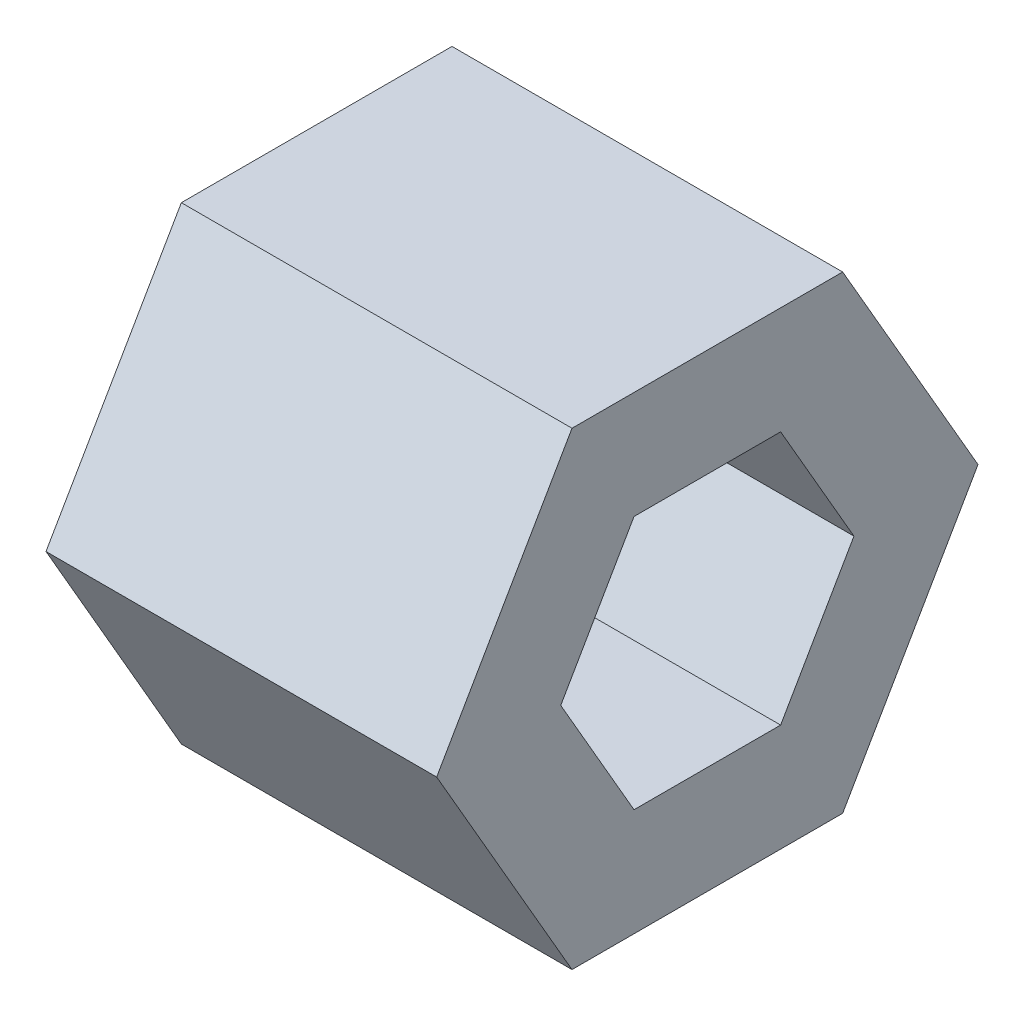
ISO-10303-21;
HEADER;
FILE_DESCRIPTION(('STEP AP214'),'2;1');
FILE_NAME('part.step','',(''),(''),'','','');
FILE_SCHEMA(('AUTOMOTIVE_DESIGN { 1 0 10303 214 1 1 1 1 }'));
ENDSEC;
DATA;
#1=APPLICATION_CONTEXT('core data for automotive mechanical design processes');
#2=APPLICATION_PROTOCOL_DEFINITION('international standard','automotive_design',2000,#1);
#3=PRODUCT_CONTEXT('',#1,'mechanical');
#4=PRODUCT('Part','Part','',(#3));
#5=PRODUCT_RELATED_PRODUCT_CATEGORY('part','',(#4));
#6=PRODUCT_DEFINITION_FORMATION('','',#4);
#7=PRODUCT_DEFINITION_CONTEXT('part definition',#1,'design');
#8=PRODUCT_DEFINITION('design','',#6,#7);
#9=PRODUCT_DEFINITION_SHAPE('','',#8);
#10=(LENGTH_UNIT() NAMED_UNIT(*) SI_UNIT(.MILLI.,.METRE.));
#11=(NAMED_UNIT(*) PLANE_ANGLE_UNIT() SI_UNIT($,.RADIAN.));
#12=(NAMED_UNIT(*) SI_UNIT($,.STERADIAN.) SOLID_ANGLE_UNIT());
#13=UNCERTAINTY_MEASURE_WITH_UNIT(LENGTH_MEASURE(1.E-05),#10,'distance_accuracy_value','');
#14=(GEOMETRIC_REPRESENTATION_CONTEXT(3) GLOBAL_UNCERTAINTY_ASSIGNED_CONTEXT((#13)) GLOBAL_UNIT_ASSIGNED_CONTEXT((#10,
#11,#12)) REPRESENTATION_CONTEXT('',''));
#15=CARTESIAN_POINT('',(0.,0.,0.));
#16=DIRECTION('',(0.,0.,1.));
#17=DIRECTION('',(1.,0.,0.));
#18=AXIS2_PLACEMENT_3D('',#15,#16,#17);
#19=CARTESIAN_POINT('',(0.,0.,0.));
#20=DIRECTION('',(1.,0.,0.));
#21=DIRECTION('',(0.,0.,-1.));
#22=AXIS2_PLACEMENT_3D('',#19,#20,#21);
#23=CYLINDRICAL_SURFACE('',#22,1.5);
#24=DIRECTION('',(1.,0.,0.));
#25=VECTOR('',#24,1.);
#26=CARTESIAN_POINT('',(0.,0.,1.5));
#27=LINE('',#26,#25);
#28=CARTESIAN_POINT('',(0.,0.,1.5));
#29=VERTEX_POINT('',#28);
#30=CARTESIAN_POINT('',(3.,0.,1.5));
#31=VERTEX_POINT('',#30);
#32=EDGE_CURVE('E275',#29,#31,#27,.T.);
#33=ORIENTED_EDGE('',*,*,#32,.F.);
#34=CARTESIAN_POINT('',(0.,0.,0.));
#35=DIRECTION('',(1.,0.,0.));
#36=DIRECTION('',(0.,0.,-1.));
#37=AXIS2_PLACEMENT_3D('',#34,#35,#36);
#38=CIRCLE('',#37,1.5);
#39=CARTESIAN_POINT('',(0.,0.,-1.5));
#40=VERTEX_POINT('',#39);
#41=EDGE_CURVE('E120',#40,#29,#38,.T.);
#42=ORIENTED_EDGE('',*,*,#41,.F.);
#43=DIRECTION('',(1.,0.,0.));
#44=VECTOR('',#43,1.);
#45=CARTESIAN_POINT('',(0.,0.,-1.5));
#46=LINE('',#45,#44);
#47=CARTESIAN_POINT('',(3.,0.,-1.5));
#48=VERTEX_POINT('',#47);
#49=EDGE_CURVE('E236',#40,#48,#46,.T.);
#50=ORIENTED_EDGE('',*,*,#49,.T.);
#51=CARTESIAN_POINT('',(3.,0.,0.));
#52=DIRECTION('',(1.,0.,0.));
#53=DIRECTION('',(0.,0.,-1.));
#54=AXIS2_PLACEMENT_3D('',#51,#52,#53);
#55=CIRCLE('',#54,1.5);
#56=EDGE_CURVE('E11',#48,#31,#55,.T.);
#57=ORIENTED_EDGE('',*,*,#56,.T.);
#58=EDGE_LOOP('',(#33,#42,#50,#57));
#59=FACE_BOUND('',#58,.T.);
#60=ADVANCED_FACE('F16',(#59),#23,.F.);
#61=CARTESIAN_POINT('',(3.,0.,0.));
#62=DIRECTION('',(1.,0.,0.));
#63=DIRECTION('',(0.,1.,0.));
#64=AXIS2_PLACEMENT_3D('',#61,#62,#63);
#65=PLANE('',#64);
#66=ORIENTED_EDGE('',*,*,#56,.F.);
#67=CARTESIAN_POINT('',(3.,0.,0.));
#68=DIRECTION('',(1.,0.,0.));
#69=DIRECTION('',(0.,0.,-1.));
#70=AXIS2_PLACEMENT_3D('',#67,#68,#69);
#71=CIRCLE('',#70,1.5);
#72=EDGE_CURVE('E291',#31,#48,#71,.T.);
#73=ORIENTED_EDGE('',*,*,#72,.F.);
#74=EDGE_LOOP('',(#66,#73));
#75=FACE_BOUND('',#74,.T.);
#76=DIRECTION('',(0.,0.866025403784439,-0.5));
#77=VECTOR('',#76,1.);
#78=CARTESIAN_POINT('',(3.,-3.25,-1.87638837486628));
#79=LINE('',#78,#77);
#80=CARTESIAN_POINT('',(3.,-3.25,-1.87638837486628));
#81=VERTEX_POINT('',#80);
#82=CARTESIAN_POINT('',(3.,0.,-3.75277674973257));
#83=VERTEX_POINT('',#82);
#84=EDGE_CURVE('E232',#81,#83,#79,.T.);
#85=ORIENTED_EDGE('',*,*,#84,.T.);
#86=DIRECTION('',(0.,0.866025403784439,0.5));
#87=VECTOR('',#86,1.);
#88=CARTESIAN_POINT('',(3.,0.,-3.75277674973257));
#89=LINE('',#88,#87);
#90=CARTESIAN_POINT('',(3.,3.25,-1.87638837486628));
#91=VERTEX_POINT('',#90);
#92=EDGE_CURVE('E26',#83,#91,#89,.T.);
#93=ORIENTED_EDGE('',*,*,#92,.T.);
#94=DIRECTION('',(0.,0.,1.));
#95=VECTOR('',#94,1.);
#96=CARTESIAN_POINT('',(3.,3.25,-1.87638837486628));
#97=LINE('',#96,#95);
#98=CARTESIAN_POINT('',(3.,3.25,1.87638837486628));
#99=VERTEX_POINT('',#98);
#100=EDGE_CURVE('E49',#91,#99,#97,.T.);
#101=ORIENTED_EDGE('',*,*,#100,.T.);
#102=DIRECTION('',(0.,-0.866025403784439,0.5));
#103=VECTOR('',#102,1.);
#104=CARTESIAN_POINT('',(3.,3.25,1.87638837486628));
#105=LINE('',#104,#103);
#106=CARTESIAN_POINT('',(3.,0.,3.75277674973256));
#107=VERTEX_POINT('',#106);
#108=EDGE_CURVE('E287',#99,#107,#105,.T.);
#109=ORIENTED_EDGE('',*,*,#108,.T.);
#110=DIRECTION('',(0.,-0.866025403784439,-0.5));
#111=VECTOR('',#110,1.);
#112=CARTESIAN_POINT('',(3.,0.,3.75277674973256));
#113=LINE('',#112,#111);
#114=CARTESIAN_POINT('',(3.,-3.25,1.87638837486628));
#115=VERTEX_POINT('',#114);
#116=EDGE_CURVE('E237',#107,#115,#113,.T.);
#117=ORIENTED_EDGE('',*,*,#116,.T.);
#118=DIRECTION('',(0.,0.,-1.));
#119=VECTOR('',#118,1.);
#120=CARTESIAN_POINT('',(3.,-3.25,1.87638837486628));
#121=LINE('',#120,#119);
#122=EDGE_CURVE('E181',#115,#81,#121,.T.);
#123=ORIENTED_EDGE('',*,*,#122,.T.);
#124=EDGE_LOOP('',(#85,#93,#101,#109,#117,#123));
#125=FACE_BOUND('',#124,.T.);
#126=ADVANCED_FACE('F511',(#75,#125),#65,.T.);
#127=CARTESIAN_POINT('',(3.,0.,-3.75277674973257));
#128=DIRECTION('',(0.,0.5,-0.866025403784439));
#129=DIRECTION('',(-1.,0.,0.));
#130=AXIS2_PLACEMENT_3D('',#127,#128,#129);
#131=PLANE('',#130);
#132=DIRECTION('',(0.,0.866025403784439,0.5));
#133=VECTOR('',#132,1.);
#134=CARTESIAN_POINT('',(10.,0.,-3.75277674973257));
#135=LINE('',#134,#133);
#136=CARTESIAN_POINT('',(10.,0.,-3.75277674973257));
#137=VERTEX_POINT('',#136);
#138=CARTESIAN_POINT('',(10.,3.25,-1.87638837486628));
#139=VERTEX_POINT('',#138);
#140=EDGE_CURVE('E250',#137,#139,#135,.T.);
#141=ORIENTED_EDGE('',*,*,#140,.T.);
#142=DIRECTION('',(1.,0.,0.));
#143=VECTOR('',#142,1.);
#144=CARTESIAN_POINT('',(3.,3.25,-1.87638837486628));
#145=LINE('',#144,#143);
#146=EDGE_CURVE('E211',#91,#139,#145,.T.);
#147=ORIENTED_EDGE('',*,*,#146,.F.);
#148=ORIENTED_EDGE('',*,*,#92,.F.);
#149=DIRECTION('',(1.,0.,0.));
#150=VECTOR('',#149,1.);
#151=CARTESIAN_POINT('',(3.,0.,-3.75277674973257));
#152=LINE('',#151,#150);
#153=EDGE_CURVE('E228',#83,#137,#152,.T.);
#154=ORIENTED_EDGE('',*,*,#153,.T.);
#155=EDGE_LOOP('',(#141,#147,#148,#154));
#156=FACE_BOUND('',#155,.T.);
#157=ADVANCED_FACE('F321',(#156),#131,.F.);
#158=CARTESIAN_POINT('',(3.,3.25,-1.87638837486628));
#159=DIRECTION('',(0.,1.,0.));
#160=DIRECTION('',(1.,0.,0.));
#161=AXIS2_PLACEMENT_3D('',#158,#159,#160);
#162=PLANE('',#161);
#163=DIRECTION('',(0.,0.,1.));
#164=VECTOR('',#163,1.);
#165=CARTESIAN_POINT('',(10.,3.25,-1.87638837486628));
#166=LINE('',#165,#164);
#167=CARTESIAN_POINT('',(10.,3.25,1.87638837486628));
#168=VERTEX_POINT('',#167);
#169=EDGE_CURVE('E227',#139,#168,#166,.T.);
#170=ORIENTED_EDGE('',*,*,#169,.T.);
#171=DIRECTION('',(1.,0.,0.));
#172=VECTOR('',#171,1.);
#173=CARTESIAN_POINT('',(3.,3.25,1.87638837486628));
#174=LINE('',#173,#172);
#175=EDGE_CURVE('E279',#99,#168,#174,.T.);
#176=ORIENTED_EDGE('',*,*,#175,.F.);
#177=ORIENTED_EDGE('',*,*,#100,.F.);
#178=ORIENTED_EDGE('',*,*,#146,.T.);
#179=EDGE_LOOP('',(#170,#176,#177,#178));
#180=FACE_BOUND('',#179,.T.);
#181=ADVANCED_FACE('F329',(#180),#162,.F.);
#182=CARTESIAN_POINT('',(3.,3.25,1.87638837486628));
#183=DIRECTION('',(0.,0.5,0.866025403784439));
#184=DIRECTION('',(1.,0.,0.));
#185=AXIS2_PLACEMENT_3D('',#182,#183,#184);
#186=PLANE('',#185);
#187=DIRECTION('',(0.,-0.866025403784439,0.5));
#188=VECTOR('',#187,1.);
#189=CARTESIAN_POINT('',(10.,3.25,1.87638837486628));
#190=LINE('',#189,#188);
#191=CARTESIAN_POINT('',(10.,0.,3.75277674973256));
#192=VERTEX_POINT('',#191);
#193=EDGE_CURVE('E197',#168,#192,#190,.T.);
#194=ORIENTED_EDGE('',*,*,#193,.T.);
#195=DIRECTION('',(1.,0.,0.));
#196=VECTOR('',#195,1.);
#197=CARTESIAN_POINT('',(3.,0.,3.75277674973256));
#198=LINE('',#197,#196);
#199=EDGE_CURVE('E240',#107,#192,#198,.T.);
#200=ORIENTED_EDGE('',*,*,#199,.F.);
#201=ORIENTED_EDGE('',*,*,#108,.F.);
#202=ORIENTED_EDGE('',*,*,#175,.T.);
#203=EDGE_LOOP('',(#194,#200,#201,#202));
#204=FACE_BOUND('',#203,.T.);
#205=ADVANCED_FACE('F555',(#204),#186,.F.);
#206=CARTESIAN_POINT('',(3.,0.,3.75277674973256));
#207=DIRECTION('',(0.,-0.5,0.866025403784439));
#208=DIRECTION('',(-1.,0.,0.));
#209=AXIS2_PLACEMENT_3D('',#206,#207,#208);
#210=PLANE('',#209);
#211=DIRECTION('',(0.,-0.866025403784439,-0.5));
#212=VECTOR('',#211,1.);
#213=CARTESIAN_POINT('',(10.,0.,3.75277674973256));
#214=LINE('',#213,#212);
#215=CARTESIAN_POINT('',(10.,-3.25,1.87638837486628));
#216=VERTEX_POINT('',#215);
#217=EDGE_CURVE('E186',#192,#216,#214,.T.);
#218=ORIENTED_EDGE('',*,*,#217,.T.);
#219=DIRECTION('',(1.,0.,0.));
#220=VECTOR('',#219,1.);
#221=CARTESIAN_POINT('',(3.,-3.25,1.87638837486628));
#222=LINE('',#221,#220);
#223=EDGE_CURVE('E241',#115,#216,#222,.T.);
#224=ORIENTED_EDGE('',*,*,#223,.F.);
#225=ORIENTED_EDGE('',*,*,#116,.F.);
#226=ORIENTED_EDGE('',*,*,#199,.T.);
#227=EDGE_LOOP('',(#218,#224,#225,#226));
#228=FACE_BOUND('',#227,.T.);
#229=ADVANCED_FACE('F536',(#228),#210,.F.);
#230=CARTESIAN_POINT('',(3.,-3.25,1.87638837486628));
#231=DIRECTION('',(0.,-1.,0.));
#232=DIRECTION('',(0.,0.,-1.));
#233=AXIS2_PLACEMENT_3D('',#230,#231,#232);
#234=PLANE('',#233);
#235=DIRECTION('',(0.,0.,-1.));
#236=VECTOR('',#235,1.);
#237=CARTESIAN_POINT('',(10.,-3.25,1.87638837486628));
#238=LINE('',#237,#236);
#239=CARTESIAN_POINT('',(10.,-3.25,-1.87638837486628));
#240=VERTEX_POINT('',#239);
#241=EDGE_CURVE('E183',#216,#240,#238,.T.);
#242=ORIENTED_EDGE('',*,*,#241,.T.);
#243=DIRECTION('',(1.,0.,0.));
#244=VECTOR('',#243,1.);
#245=CARTESIAN_POINT('',(3.,-3.25,-1.87638837486628));
#246=LINE('',#245,#244);
#247=EDGE_CURVE('E259',#81,#240,#246,.T.);
#248=ORIENTED_EDGE('',*,*,#247,.F.);
#249=ORIENTED_EDGE('',*,*,#122,.F.);
#250=ORIENTED_EDGE('',*,*,#223,.T.);
#251=EDGE_LOOP('',(#242,#248,#249,#250));
#252=FACE_BOUND('',#251,.T.);
#253=ADVANCED_FACE('F532',(#252),#234,.F.);
#254=CARTESIAN_POINT('',(3.,-3.25,-1.87638837486628));
#255=DIRECTION('',(0.,-0.5,-0.866025403784439));
#256=DIRECTION('',(0.,-0.866025403784439,0.5));
#257=AXIS2_PLACEMENT_3D('',#254,#255,#256);
#258=PLANE('',#257);
#259=DIRECTION('',(0.,0.866025403784439,-0.5));
#260=VECTOR('',#259,1.);
#261=CARTESIAN_POINT('',(10.,-3.25,-1.87638837486628));
#262=LINE('',#261,#260);
#263=EDGE_CURVE('E159',#240,#137,#262,.T.);
#264=ORIENTED_EDGE('',*,*,#263,.T.);
#265=ORIENTED_EDGE('',*,*,#153,.F.);
#266=ORIENTED_EDGE('',*,*,#84,.F.);
#267=ORIENTED_EDGE('',*,*,#247,.T.);
#268=EDGE_LOOP('',(#264,#265,#266,#267));
#269=FACE_BOUND('',#268,.T.);
#270=ADVANCED_FACE('F525',(#269),#258,.F.);
#271=CARTESIAN_POINT('',(0.,0.,0.));
#272=DIRECTION('',(1.,0.,0.));
#273=DIRECTION('',(0.,1.,0.));
#274=AXIS2_PLACEMENT_3D('',#271,#272,#273);
#275=PLANE('',#274);
#276=ORIENTED_EDGE('',*,*,#41,.T.);
#277=CARTESIAN_POINT('',(0.,0.,0.));
#278=DIRECTION('',(1.,0.,0.));
#279=DIRECTION('',(0.,0.,-1.));
#280=AXIS2_PLACEMENT_3D('',#277,#278,#279);
#281=CIRCLE('',#280,1.5);
#282=EDGE_CURVE('E273',#29,#40,#281,.T.);
#283=ORIENTED_EDGE('',*,*,#282,.T.);
#284=EDGE_LOOP('',(#276,#283));
#285=FACE_BOUND('',#284,.T.);
#286=DIRECTION('',(0.,0.866025403784442,-0.5));
#287=VECTOR('',#286,1.);
#288=CARTESIAN_POINT('',(0.,-6.,-3.46410161513782));
#289=LINE('',#288,#287);
#290=CARTESIAN_POINT('',(0.,-6.,-3.46410161513782));
#291=VERTEX_POINT('',#290);
#292=CARTESIAN_POINT('',(0.,0.,-6.92820323027551));
#293=VERTEX_POINT('',#292);
#294=EDGE_CURVE('E223',#291,#293,#289,.T.);
#295=ORIENTED_EDGE('',*,*,#294,.F.);
#296=DIRECTION('',(0.,0.,-1.));
#297=VECTOR('',#296,1.);
#298=CARTESIAN_POINT('',(0.,-6.,3.4641016151377));
#299=LINE('',#298,#297);
#300=CARTESIAN_POINT('',(0.,-6.,3.4641016151377));
#301=VERTEX_POINT('',#300);
#302=EDGE_CURVE('E84',#301,#291,#299,.T.);
#303=ORIENTED_EDGE('',*,*,#302,.F.);
#304=DIRECTION('',(0.,-0.866025403784435,-0.500000000000007));
#305=VECTOR('',#304,1.);
#306=CARTESIAN_POINT('',(0.,0.,6.92820323027551));
#307=LINE('',#306,#305);
#308=CARTESIAN_POINT('',(0.,0.,6.92820323027551));
#309=VERTEX_POINT('',#308);
#310=EDGE_CURVE('E172',#309,#301,#307,.T.);
#311=ORIENTED_EDGE('',*,*,#310,.F.);
#312=DIRECTION('',(0.,-0.866025403784442,0.5));
#313=VECTOR('',#312,1.);
#314=CARTESIAN_POINT('',(0.,6.,3.46410161513779));
#315=LINE('',#314,#313);
#316=CARTESIAN_POINT('',(0.,6.,3.46410161513779));
#317=VERTEX_POINT('',#316);
#318=EDGE_CURVE('E207',#317,#309,#315,.T.);
#319=ORIENTED_EDGE('',*,*,#318,.F.);
#320=DIRECTION('',(0.,0.,1.));
#321=VECTOR('',#320,1.);
#322=CARTESIAN_POINT('',(0.,6.,-3.46410161513774));
#323=LINE('',#322,#321);
#324=CARTESIAN_POINT('',(0.,6.,-3.46410161513774));
#325=VERTEX_POINT('',#324);
#326=EDGE_CURVE('E283',#325,#317,#323,.T.);
#327=ORIENTED_EDGE('',*,*,#326,.F.);
#328=DIRECTION('',(0.,0.866025403784438,0.5));
#329=VECTOR('',#328,1.);
#330=CARTESIAN_POINT('',(0.,0.,-6.92820323027551));
#331=LINE('',#330,#329);
#332=EDGE_CURVE('E67',#293,#325,#331,.T.);
#333=ORIENTED_EDGE('',*,*,#332,.F.);
#334=EDGE_LOOP('',(#295,#303,#311,#319,#327,#333));
#335=FACE_BOUND('',#334,.T.);
#336=ADVANCED_FACE('F364',(#285,#335),#275,.F.);
#337=CARTESIAN_POINT('',(10.,0.,0.));
#338=DIRECTION('',(1.,0.,0.));
#339=DIRECTION('',(0.,1.,0.));
#340=AXIS2_PLACEMENT_3D('',#337,#338,#339);
#341=PLANE('',#340);
#342=ORIENTED_EDGE('',*,*,#263,.F.);
#343=ORIENTED_EDGE('',*,*,#241,.F.);
#344=ORIENTED_EDGE('',*,*,#217,.F.);
#345=ORIENTED_EDGE('',*,*,#193,.F.);
#346=ORIENTED_EDGE('',*,*,#169,.F.);
#347=ORIENTED_EDGE('',*,*,#140,.F.);
#348=EDGE_LOOP('',(#342,#343,#344,#345,#346,#347));
#349=FACE_BOUND('',#348,.T.);
#350=DIRECTION('',(0.,0.866025403784442,-0.5));
#351=VECTOR('',#350,1.);
#352=CARTESIAN_POINT('',(10.,-6.,-3.46410161513782));
#353=LINE('',#352,#351);
#354=CARTESIAN_POINT('',(10.,-6.,-3.46410161513782));
#355=VERTEX_POINT('',#354);
#356=CARTESIAN_POINT('',(10.,0.,-6.92820323027551));
#357=VERTEX_POINT('',#356);
#358=EDGE_CURVE('E222',#355,#357,#353,.T.);
#359=ORIENTED_EDGE('',*,*,#358,.T.);
#360=DIRECTION('',(0.,0.866025403784438,0.5));
#361=VECTOR('',#360,1.);
#362=CARTESIAN_POINT('',(10.,0.,-6.92820323027551));
#363=LINE('',#362,#361);
#364=CARTESIAN_POINT('',(10.,6.,-3.46410161513774));
#365=VERTEX_POINT('',#364);
#366=EDGE_CURVE('E246',#357,#365,#363,.T.);
#367=ORIENTED_EDGE('',*,*,#366,.T.);
#368=DIRECTION('',(0.,0.,1.));
#369=VECTOR('',#368,1.);
#370=CARTESIAN_POINT('',(10.,6.,-3.46410161513774));
#371=LINE('',#370,#369);
#372=CARTESIAN_POINT('',(10.,6.,3.46410161513779));
#373=VERTEX_POINT('',#372);
#374=EDGE_CURVE('E215',#365,#373,#371,.T.);
#375=ORIENTED_EDGE('',*,*,#374,.T.);
#376=DIRECTION('',(0.,-0.866025403784442,0.5));
#377=VECTOR('',#376,1.);
#378=CARTESIAN_POINT('',(10.,6.,3.46410161513779));
#379=LINE('',#378,#377);
#380=CARTESIAN_POINT('',(10.,0.,6.92820323027551));
#381=VERTEX_POINT('',#380);
#382=EDGE_CURVE('E165',#373,#381,#379,.T.);
#383=ORIENTED_EDGE('',*,*,#382,.T.);
#384=DIRECTION('',(0.,-0.866025403784435,-0.500000000000007));
#385=VECTOR('',#384,1.);
#386=CARTESIAN_POINT('',(10.,0.,6.92820323027551));
#387=LINE('',#386,#385);
#388=CARTESIAN_POINT('',(10.,-6.,3.4641016151377));
#389=VERTEX_POINT('',#388);
#390=EDGE_CURVE('E162',#381,#389,#387,.T.);
#391=ORIENTED_EDGE('',*,*,#390,.T.);
#392=DIRECTION('',(0.,0.,-1.));
#393=VECTOR('',#392,1.);
#394=CARTESIAN_POINT('',(10.,-6.,3.4641016151377));
#395=LINE('',#394,#393);
#396=EDGE_CURVE('E149',#389,#355,#395,.T.);
#397=ORIENTED_EDGE('',*,*,#396,.T.);
#398=EDGE_LOOP('',(#359,#367,#375,#383,#391,#397));
#399=FACE_BOUND('',#398,.T.);
#400=ADVANCED_FACE('F163',(#349,#399),#341,.T.);
#401=CARTESIAN_POINT('',(10.,-6.,3.4641016151377));
#402=DIRECTION('',(0.,1.,0.));
#403=DIRECTION('',(0.,0.,-1.));
#404=AXIS2_PLACEMENT_3D('',#401,#402,#403);
#405=PLANE('',#404);
#406=ORIENTED_EDGE('',*,*,#302,.T.);
#407=DIRECTION('',(-1.,0.,0.));
#408=VECTOR('',#407,1.);
#409=CARTESIAN_POINT('',(10.,-6.,-3.46410161513782));
#410=LINE('',#409,#408);
#411=EDGE_CURVE('E20',#355,#291,#410,.T.);
#412=ORIENTED_EDGE('',*,*,#411,.F.);
#413=ORIENTED_EDGE('',*,*,#396,.F.);
#414=DIRECTION('',(-1.,0.,0.));
#415=VECTOR('',#414,1.);
#416=CARTESIAN_POINT('',(10.,-6.,3.4641016151377));
#417=LINE('',#416,#415);
#418=EDGE_CURVE('E153',#389,#301,#417,.T.);
#419=ORIENTED_EDGE('',*,*,#418,.T.);
#420=EDGE_LOOP('',(#406,#412,#413,#419));
#421=FACE_BOUND('',#420,.T.);
#422=ADVANCED_FACE('F151',(#421),#405,.F.);
#423=CARTESIAN_POINT('',(10.,0.,6.92820323027551));
#424=DIRECTION('',(0.,0.500000000000007,-0.866025403784435));
#425=DIRECTION('',(-1.,0.,0.));
#426=AXIS2_PLACEMENT_3D('',#423,#424,#425);
#427=PLANE('',#426);
#428=ORIENTED_EDGE('',*,*,#310,.T.);
#429=ORIENTED_EDGE('',*,*,#418,.F.);
#430=ORIENTED_EDGE('',*,*,#390,.F.);
#431=DIRECTION('',(-1.,0.,0.));
#432=VECTOR('',#431,1.);
#433=CARTESIAN_POINT('',(10.,0.,6.92820323027551));
#434=LINE('',#433,#432);
#435=EDGE_CURVE('E210',#381,#309,#434,.T.);
#436=ORIENTED_EDGE('',*,*,#435,.T.);
#437=EDGE_LOOP('',(#428,#429,#430,#436));
#438=FACE_BOUND('',#437,.T.);
#439=ADVANCED_FACE('F171',(#438),#427,.F.);
#440=CARTESIAN_POINT('',(10.,6.,3.46410161513779));
#441=DIRECTION('',(0.,-0.5,-0.866025403784441));
#442=DIRECTION('',(0.,-0.866025403784441,0.5));
#443=AXIS2_PLACEMENT_3D('',#440,#441,#442);
#444=PLANE('',#443);
#445=ORIENTED_EDGE('',*,*,#318,.T.);
#446=ORIENTED_EDGE('',*,*,#435,.F.);
#447=ORIENTED_EDGE('',*,*,#382,.F.);
#448=DIRECTION('',(-1.,0.,0.));
#449=VECTOR('',#448,1.);
#450=CARTESIAN_POINT('',(10.,6.,3.46410161513779));
#451=LINE('',#450,#449);
#452=EDGE_CURVE('E218',#373,#317,#451,.T.);
#453=ORIENTED_EDGE('',*,*,#452,.T.);
#454=EDGE_LOOP('',(#445,#446,#447,#453));
#455=FACE_BOUND('',#454,.T.);
#456=ADVANCED_FACE('F366',(#455),#444,.F.);
#457=CARTESIAN_POINT('',(10.,6.,-3.46410161513774));
#458=DIRECTION('',(0.,-1.,0.));
#459=DIRECTION('',(0.,0.,-1.));
#460=AXIS2_PLACEMENT_3D('',#457,#458,#459);
#461=PLANE('',#460);
#462=ORIENTED_EDGE('',*,*,#326,.T.);
#463=ORIENTED_EDGE('',*,*,#452,.F.);
#464=ORIENTED_EDGE('',*,*,#374,.F.);
#465=DIRECTION('',(-1.,0.,0.));
#466=VECTOR('',#465,1.);
#467=CARTESIAN_POINT('',(10.,6.,-3.46410161513774));
#468=LINE('',#467,#466);
#469=EDGE_CURVE('E242',#365,#325,#468,.T.);
#470=ORIENTED_EDGE('',*,*,#469,.T.);
#471=EDGE_LOOP('',(#462,#463,#464,#470));
#472=FACE_BOUND('',#471,.T.);
#473=ADVANCED_FACE('F357',(#472),#461,.F.);
#474=CARTESIAN_POINT('',(10.,0.,-6.92820323027551));
#475=DIRECTION('',(0.,-0.5,0.866025403784438));
#476=DIRECTION('',(-1.,0.,0.));
#477=AXIS2_PLACEMENT_3D('',#474,#475,#476);
#478=PLANE('',#477);
#479=ORIENTED_EDGE('',*,*,#332,.T.);
#480=ORIENTED_EDGE('',*,*,#469,.F.);
#481=ORIENTED_EDGE('',*,*,#366,.F.);
#482=DIRECTION('',(-1.,0.,0.));
#483=VECTOR('',#482,1.);
#484=CARTESIAN_POINT('',(10.,0.,-6.92820323027551));
#485=LINE('',#484,#483);
#486=EDGE_CURVE('E219',#357,#293,#485,.T.);
#487=ORIENTED_EDGE('',*,*,#486,.T.);
#488=EDGE_LOOP('',(#479,#480,#481,#487));
#489=FACE_BOUND('',#488,.T.);
#490=ADVANCED_FACE('F361',(#489),#478,.F.);
#491=CARTESIAN_POINT('',(10.,-6.,-3.46410161513782));
#492=DIRECTION('',(0.,0.5,0.866025403784442));
#493=DIRECTION('',(1.,0.,0.));
#494=AXIS2_PLACEMENT_3D('',#491,#492,#493);
#495=PLANE('',#494);
#496=ORIENTED_EDGE('',*,*,#294,.T.);
#497=ORIENTED_EDGE('',*,*,#486,.F.);
#498=ORIENTED_EDGE('',*,*,#358,.F.);
#499=ORIENTED_EDGE('',*,*,#411,.T.);
#500=EDGE_LOOP('',(#496,#497,#498,#499));
#501=FACE_BOUND('',#500,.T.);
#502=ADVANCED_FACE('F363',(#501),#495,.F.);
#503=CARTESIAN_POINT('',(0.,0.,0.));
#504=DIRECTION('',(1.,0.,0.));
#505=DIRECTION('',(0.,0.,-1.));
#506=AXIS2_PLACEMENT_3D('',#503,#504,#505);
#507=CYLINDRICAL_SURFACE('',#506,1.5);
#508=ORIENTED_EDGE('',*,*,#282,.F.);
#509=ORIENTED_EDGE('',*,*,#32,.T.);
#510=ORIENTED_EDGE('',*,*,#72,.T.);
#511=ORIENTED_EDGE('',*,*,#49,.F.);
#512=EDGE_LOOP('',(#508,#509,#510,#511));
#513=FACE_BOUND('',#512,.T.);
#514=ADVANCED_FACE('F18',(#513),#507,.F.);
#515=CLOSED_SHELL('',(#60,#126,#157,#181,#205,#229,#253,#270,#336,#400,#422,#439,#456,#473,#490,
#502,#514));
#516=MANIFOLD_SOLID_BREP('B1',#515);
#517=ADVANCED_BREP_SHAPE_REPRESENTATION('',(#18,#516),#14);
#518=SHAPE_DEFINITION_REPRESENTATION(#9,#517);
ENDSEC;
END-ISO-10303-21;
